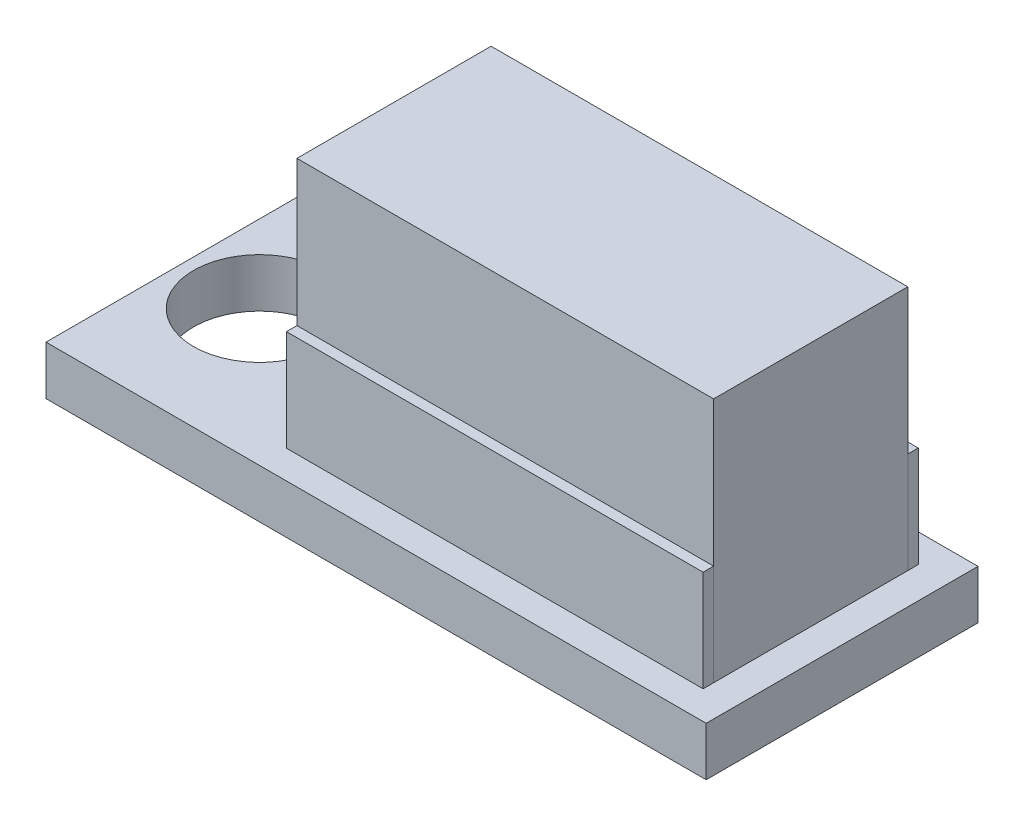
ISO-10303-21;
HEADER;
FILE_DESCRIPTION(('STEP AP214'),'2;1');
FILE_NAME('part.step','',(''),(''),'','','');
FILE_SCHEMA(('AUTOMOTIVE_DESIGN { 1 0 10303 214 1 1 1 1 }'));
ENDSEC;
DATA;
#1=APPLICATION_CONTEXT('core data for automotive mechanical design processes');
#2=APPLICATION_PROTOCOL_DEFINITION('international standard','automotive_design',2000,#1);
#3=PRODUCT_CONTEXT('',#1,'mechanical');
#4=PRODUCT('Part','Part','',(#3));
#5=PRODUCT_RELATED_PRODUCT_CATEGORY('part','',(#4));
#6=PRODUCT_DEFINITION_FORMATION('','',#4);
#7=PRODUCT_DEFINITION_CONTEXT('part definition',#1,'design');
#8=PRODUCT_DEFINITION('design','',#6,#7);
#9=PRODUCT_DEFINITION_SHAPE('','',#8);
#10=(LENGTH_UNIT() NAMED_UNIT(*) SI_UNIT(.MILLI.,.METRE.));
#11=(NAMED_UNIT(*) PLANE_ANGLE_UNIT() SI_UNIT($,.RADIAN.));
#12=(NAMED_UNIT(*) SI_UNIT($,.STERADIAN.) SOLID_ANGLE_UNIT());
#13=UNCERTAINTY_MEASURE_WITH_UNIT(LENGTH_MEASURE(1.E-05),#10,'distance_accuracy_value','');
#14=(GEOMETRIC_REPRESENTATION_CONTEXT(3) GLOBAL_UNCERTAINTY_ASSIGNED_CONTEXT((#13)) GLOBAL_UNIT_ASSIGNED_CONTEXT((#10,
#11,#12)) REPRESENTATION_CONTEXT('',''));
#15=CARTESIAN_POINT('',(0.,0.,0.));
#16=DIRECTION('',(0.,0.,1.));
#17=DIRECTION('',(1.,0.,0.));
#18=AXIS2_PLACEMENT_3D('',#15,#16,#17);
#19=CARTESIAN_POINT('',(-44.7585645073612,9.6393,17.3614974714582));
#20=DIRECTION('',(1.,0.,0.));
#21=DIRECTION('',(0.,0.,-1.));
#22=AXIS2_PLACEMENT_3D('',#19,#20,#21);
#23=PLANE('',#22);
#24=DIRECTION('',(0.,0.,1.));
#25=VECTOR('',#24,1.);
#26=CARTESIAN_POINT('',(-44.7585645073612,0.,17.3614974714582));
#27=LINE('',#26,#25);
#28=CARTESIAN_POINT('',(-44.7585645073612,0.,17.3614974714582));
#29=VERTEX_POINT('',#28);
#30=CARTESIAN_POINT('',(-44.7585645073612,0.,23.7114974714582));
#31=VERTEX_POINT('',#30);
#32=EDGE_CURVE('E106',#29,#31,#27,.T.);
#33=ORIENTED_EDGE('',*,*,#32,.T.);
#34=DIRECTION('',(0.,-1.,0.));
#35=VECTOR('',#34,1.);
#36=CARTESIAN_POINT('',(-44.7585645073612,9.6393,23.7114974714582));
#37=LINE('',#36,#35);
#38=CARTESIAN_POINT('',(-44.7585645073612,9.6393,23.7114974714582));
#39=VERTEX_POINT('',#38);
#40=EDGE_CURVE('E12',#39,#31,#37,.T.);
#41=ORIENTED_EDGE('',*,*,#40,.F.);
#42=DIRECTION('',(0.,0.,1.));
#43=VECTOR('',#42,1.);
#44=CARTESIAN_POINT('',(-44.7585645073612,9.6393,17.3614974714582));
#45=LINE('',#44,#43);
#46=CARTESIAN_POINT('',(-44.7585645073612,9.6393,17.3614974714582));
#47=VERTEX_POINT('',#46);
#48=EDGE_CURVE('E94',#47,#39,#45,.T.);
#49=ORIENTED_EDGE('',*,*,#48,.F.);
#50=DIRECTION('',(0.,-1.,0.));
#51=VECTOR('',#50,1.);
#52=CARTESIAN_POINT('',(-44.7585645073612,9.6393,17.3614974714582));
#53=LINE('',#52,#51);
#54=EDGE_CURVE('E102',#47,#29,#53,.T.);
#55=ORIENTED_EDGE('',*,*,#54,.T.);
#56=EDGE_LOOP('',(#33,#41,#49,#55));
#57=FACE_BOUND('',#56,.T.);
#58=ADVANCED_FACE('F43',(#57),#23,.F.);
#59=CARTESIAN_POINT('',(-44.7585645073612,9.6393,23.7114974714582));
#60=DIRECTION('',(0.,0.,-1.));
#61=DIRECTION('',(-1.,0.,0.));
#62=AXIS2_PLACEMENT_3D('',#59,#60,#61);
#63=PLANE('',#62);
#64=DIRECTION('',(1.,0.,0.));
#65=VECTOR('',#64,1.);
#66=CARTESIAN_POINT('',(-44.7585645073612,0.,23.7114974714582));
#67=LINE('',#66,#65);
#68=CARTESIAN_POINT('',(-31.1314645073612,0.,23.7114974714582));
#69=VERTEX_POINT('',#68);
#70=EDGE_CURVE('E98',#31,#69,#67,.T.);
#71=ORIENTED_EDGE('',*,*,#70,.T.);
#72=DIRECTION('',(0.,-1.,0.));
#73=VECTOR('',#72,1.);
#74=CARTESIAN_POINT('',(-31.1314645073612,9.6393,23.7114974714582));
#75=LINE('',#74,#73);
#76=CARTESIAN_POINT('',(-31.1314645073612,9.6393,23.7114974714582));
#77=VERTEX_POINT('',#76);
#78=EDGE_CURVE('E51',#77,#69,#75,.T.);
#79=ORIENTED_EDGE('',*,*,#78,.F.);
#80=DIRECTION('',(1.,0.,0.));
#81=VECTOR('',#80,1.);
#82=CARTESIAN_POINT('',(-44.7585645073612,9.6393,23.7114974714582));
#83=LINE('',#82,#81);
#84=EDGE_CURVE('E89',#39,#77,#83,.T.);
#85=ORIENTED_EDGE('',*,*,#84,.F.);
#86=ORIENTED_EDGE('',*,*,#40,.T.);
#87=EDGE_LOOP('',(#71,#79,#85,#86));
#88=FACE_BOUND('',#87,.T.);
#89=ADVANCED_FACE('F97',(#88),#63,.F.);
#90=CARTESIAN_POINT('',(-31.1314645073612,9.6393,17.3614974714582));
#91=DIRECTION('',(-1.,0.,0.));
#92=DIRECTION('',(0.,0.,1.));
#93=AXIS2_PLACEMENT_3D('',#90,#91,#92);
#94=PLANE('',#93);
#95=DIRECTION('',(0.,0.,-1.));
#96=VECTOR('',#95,1.);
#97=CARTESIAN_POINT('',(-31.1314645073612,0.,17.3614974714582));
#98=LINE('',#97,#96);
#99=CARTESIAN_POINT('',(-31.1314645073612,0.,17.3614974714582));
#100=VERTEX_POINT('',#99);
#101=EDGE_CURVE('E76',#69,#100,#98,.T.);
#102=ORIENTED_EDGE('',*,*,#101,.T.);
#103=DIRECTION('',(0.,-1.,0.));
#104=VECTOR('',#103,1.);
#105=CARTESIAN_POINT('',(-31.1314645073612,9.6393,17.3614974714582));
#106=LINE('',#105,#104);
#107=CARTESIAN_POINT('',(-31.1314645073612,9.6393,17.3614974714582));
#108=VERTEX_POINT('',#107);
#109=EDGE_CURVE('E99',#108,#100,#106,.T.);
#110=ORIENTED_EDGE('',*,*,#109,.F.);
#111=DIRECTION('',(0.,0.,-1.));
#112=VECTOR('',#111,1.);
#113=CARTESIAN_POINT('',(-31.1314645073612,9.6393,17.3614974714582));
#114=LINE('',#113,#112);
#115=EDGE_CURVE('E92',#77,#108,#114,.T.);
#116=ORIENTED_EDGE('',*,*,#115,.F.);
#117=ORIENTED_EDGE('',*,*,#78,.T.);
#118=EDGE_LOOP('',(#102,#110,#116,#117));
#119=FACE_BOUND('',#118,.T.);
#120=ADVANCED_FACE('F100',(#119),#94,.F.);
#121=CARTESIAN_POINT('',(-44.7585645073612,9.6393,17.3614974714582));
#122=DIRECTION('',(0.,0.,1.));
#123=DIRECTION('',(1.,0.,0.));
#124=AXIS2_PLACEMENT_3D('',#121,#122,#123);
#125=PLANE('',#124);
#126=DIRECTION('',(-1.,0.,0.));
#127=VECTOR('',#126,1.);
#128=CARTESIAN_POINT('',(-44.7585645073612,0.,17.3614974714582));
#129=LINE('',#128,#127);
#130=EDGE_CURVE('E82',#100,#29,#129,.T.);
#131=ORIENTED_EDGE('',*,*,#130,.T.);
#132=ORIENTED_EDGE('',*,*,#54,.F.);
#133=DIRECTION('',(-1.,0.,0.));
#134=VECTOR('',#133,1.);
#135=CARTESIAN_POINT('',(-44.7585645073612,9.6393,17.3614974714582));
#136=LINE('',#135,#134);
#137=EDGE_CURVE('E59',#108,#47,#136,.T.);
#138=ORIENTED_EDGE('',*,*,#137,.F.);
#139=ORIENTED_EDGE('',*,*,#109,.T.);
#140=EDGE_LOOP('',(#131,#132,#138,#139));
#141=FACE_BOUND('',#140,.T.);
#142=ADVANCED_FACE('F113',(#141),#125,.F.);
#143=CARTESIAN_POINT('',(0.,9.6393,0.));
#144=DIRECTION('',(0.,1.,0.));
#145=DIRECTION('',(0.,0.,1.));
#146=AXIS2_PLACEMENT_3D('',#143,#144,#145);
#147=PLANE('',#146);
#148=ORIENTED_EDGE('',*,*,#48,.T.);
#149=ORIENTED_EDGE('',*,*,#84,.T.);
#150=ORIENTED_EDGE('',*,*,#115,.T.);
#151=ORIENTED_EDGE('',*,*,#137,.T.);
#152=EDGE_LOOP('',(#148,#149,#150,#151));
#153=FACE_BOUND('',#152,.T.);
#154=ADVANCED_FACE('F90',(#153),#147,.T.);
#155=CARTESIAN_POINT('',(0.,0.,0.));
#156=DIRECTION('',(0.,1.,0.));
#157=DIRECTION('',(0.,0.,1.));
#158=AXIS2_PLACEMENT_3D('',#155,#156,#157);
#159=PLANE('',#158);
#160=ORIENTED_EDGE('',*,*,#32,.F.);
#161=ORIENTED_EDGE('',*,*,#130,.F.);
#162=ORIENTED_EDGE('',*,*,#101,.F.);
#163=ORIENTED_EDGE('',*,*,#70,.F.);
#164=EDGE_LOOP('',(#160,#161,#162,#163));
#165=FACE_BOUND('',#164,.T.);
#166=ADVANCED_FACE('F116',(#165),#159,.F.);
#167=CLOSED_SHELL('',(#58,#89,#120,#142,#154,#166));
#168=MANIFOLD_SOLID_BREP('B2',#167);
#169=CARTESIAN_POINT('',(0.,1.6002,0.));
#170=DIRECTION('',(0.,1.,0.));
#171=DIRECTION('',(0.,0.,1.));
#172=AXIS2_PLACEMENT_3D('',#169,#170,#171);
#173=PLANE('',#172);
#174=DIRECTION('',(0.,0.,1.));
#175=VECTOR('',#174,1.);
#176=CARTESIAN_POINT('',(-51.6949913910025,1.6002,16.0914974714582));
#177=LINE('',#176,#175);
#178=CARTESIAN_POINT('',(-51.6949913910025,1.6002,16.0914974714582));
#179=VERTEX_POINT('',#178);
#180=CARTESIAN_POINT('',(-51.6949913910025,1.6002,24.9814974714582));
#181=VERTEX_POINT('',#180);
#182=EDGE_CURVE('E285',#179,#181,#177,.T.);
#183=ORIENTED_EDGE('',*,*,#182,.T.);
#184=DIRECTION('',(1.,0.,0.));
#185=VECTOR('',#184,1.);
#186=CARTESIAN_POINT('',(-51.6949913910025,1.6002,24.9814974714582));
#187=LINE('',#186,#185);
#188=CARTESIAN_POINT('',(-30.1049913910025,1.6002,24.9814974714582));
#189=VERTEX_POINT('',#188);
#190=EDGE_CURVE('E219',#181,#189,#187,.T.);
#191=ORIENTED_EDGE('',*,*,#190,.T.);
#192=DIRECTION('',(0.,0.,-1.));
#193=VECTOR('',#192,1.);
#194=CARTESIAN_POINT('',(-30.1049913910025,1.6002,16.0914974714582));
#195=LINE('',#194,#193);
#196=CARTESIAN_POINT('',(-30.1049913910025,1.6002,16.0914974714582));
#197=VERTEX_POINT('',#196);
#198=EDGE_CURVE('E288',#189,#197,#195,.T.);
#199=ORIENTED_EDGE('',*,*,#198,.T.);
#200=DIRECTION('',(-1.,0.,0.));
#201=VECTOR('',#200,1.);
#202=CARTESIAN_POINT('',(-51.6949913910025,1.6002,16.0914974714582));
#203=LINE('',#202,#201);
#204=EDGE_CURVE('E191',#197,#179,#203,.T.);
#205=ORIENTED_EDGE('',*,*,#204,.T.);
#206=EDGE_LOOP('',(#183,#191,#199,#205));
#207=FACE_BOUND('',#206,.T.);
#208=CARTESIAN_POINT('',(-49.1549913910025,1.6002,20.5364974714582));
#209=DIRECTION('',(0.,1.,0.));
#210=DIRECTION('',(0.,0.,1.));
#211=AXIS2_PLACEMENT_3D('',#208,#209,#210);
#212=CIRCLE('',#211,2.159);
#213=CARTESIAN_POINT('',(-49.1549913910025,1.6002,22.6954974714582));
#214=VERTEX_POINT('',#213);
#215=EDGE_CURVE('E279',#214,#214,#212,.T.);
#216=ORIENTED_EDGE('',*,*,#215,.F.);
#217=EDGE_LOOP('',(#216));
#218=FACE_BOUND('',#217,.T.);
#219=DIRECTION('',(1.,0.,0.));
#220=VECTOR('',#219,1.);
#221=CARTESIAN_POINT('',(0.,1.6002,17.0185974714582));
#222=LINE('',#221,#220);
#223=CARTESIAN_POINT('',(-44.7585645073612,1.6002,17.0185974714582));
#224=VERTEX_POINT('',#223);
#225=CARTESIAN_POINT('',(-31.1314645073612,1.6002,17.0185974714582));
#226=VERTEX_POINT('',#225);
#227=EDGE_CURVE('E275',#224,#226,#222,.T.);
#228=ORIENTED_EDGE('',*,*,#227,.T.);
#229=DIRECTION('',(0.,0.,1.));
#230=VECTOR('',#229,1.);
#231=CARTESIAN_POINT('',(-31.1314645073612,1.6002,0.));
#232=LINE('',#231,#230);
#233=CARTESIAN_POINT('',(-31.1314645073612,1.6002,24.0543974714582));
#234=VERTEX_POINT('',#233);
#235=EDGE_CURVE('E264',#226,#234,#232,.T.);
#236=ORIENTED_EDGE('',*,*,#235,.T.);
#237=DIRECTION('',(-1.,0.,0.));
#238=VECTOR('',#237,1.);
#239=CARTESIAN_POINT('',(0.,1.6002,24.0543974714582));
#240=LINE('',#239,#238);
#241=CARTESIAN_POINT('',(-44.7585645073612,1.6002,24.0543974714582));
#242=VERTEX_POINT('',#241);
#243=EDGE_CURVE('E265',#234,#242,#240,.T.);
#244=ORIENTED_EDGE('',*,*,#243,.T.);
#245=DIRECTION('',(0.,0.,-1.));
#246=VECTOR('',#245,1.);
#247=CARTESIAN_POINT('',(-44.7585645073612,1.6002,0.));
#248=LINE('',#247,#246);
#249=EDGE_CURVE('E268',#242,#224,#248,.T.);
#250=ORIENTED_EDGE('',*,*,#249,.T.);
#251=EDGE_LOOP('',(#228,#236,#244,#250));
#252=FACE_BOUND('',#251,.T.);
#253=ADVANCED_FACE('F167',(#207,#218,#252),#173,.T.);
#254=CARTESIAN_POINT('',(0.,0.,0.));
#255=DIRECTION('',(0.,1.,0.));
#256=DIRECTION('',(0.,0.,1.));
#257=AXIS2_PLACEMENT_3D('',#254,#255,#256);
#258=PLANE('',#257);
#259=CARTESIAN_POINT('',(-49.1549913910025,0.,20.5364974714582));
#260=DIRECTION('',(0.,1.,0.));
#261=DIRECTION('',(0.,0.,1.));
#262=AXIS2_PLACEMENT_3D('',#259,#260,#261);
#263=CIRCLE('',#262,2.159);
#264=CARTESIAN_POINT('',(-49.1549913910025,0.,22.6954974714582));
#265=VERTEX_POINT('',#264);
#266=EDGE_CURVE('E278',#265,#265,#263,.T.);
#267=ORIENTED_EDGE('',*,*,#266,.T.);
#268=EDGE_LOOP('',(#267));
#269=FACE_BOUND('',#268,.T.);
#270=DIRECTION('',(0.,0.,1.));
#271=VECTOR('',#270,1.);
#272=CARTESIAN_POINT('',(-51.6949913910025,0.,16.0914974714582));
#273=LINE('',#272,#271);
#274=CARTESIAN_POINT('',(-51.6949913910025,0.,16.0914974714582));
#275=VERTEX_POINT('',#274);
#276=CARTESIAN_POINT('',(-51.6949913910025,0.,24.9814974714582));
#277=VERTEX_POINT('',#276);
#278=EDGE_CURVE('E282',#275,#277,#273,.T.);
#279=ORIENTED_EDGE('',*,*,#278,.F.);
#280=DIRECTION('',(-1.,0.,0.));
#281=VECTOR('',#280,1.);
#282=CARTESIAN_POINT('',(-51.6949913910025,0.,16.0914974714582));
#283=LINE('',#282,#281);
#284=CARTESIAN_POINT('',(-30.1049913910025,0.,16.0914974714582));
#285=VERTEX_POINT('',#284);
#286=EDGE_CURVE('E212',#285,#275,#283,.T.);
#287=ORIENTED_EDGE('',*,*,#286,.F.);
#288=DIRECTION('',(0.,0.,-1.));
#289=VECTOR('',#288,1.);
#290=CARTESIAN_POINT('',(-30.1049913910025,0.,16.0914974714582));
#291=LINE('',#290,#289);
#292=CARTESIAN_POINT('',(-30.1049913910025,0.,24.9814974714582));
#293=VERTEX_POINT('',#292);
#294=EDGE_CURVE('E296',#293,#285,#291,.T.);
#295=ORIENTED_EDGE('',*,*,#294,.F.);
#296=DIRECTION('',(1.,0.,0.));
#297=VECTOR('',#296,1.);
#298=CARTESIAN_POINT('',(-51.6949913910025,0.,24.9814974714582));
#299=LINE('',#298,#297);
#300=EDGE_CURVE('E294',#277,#293,#299,.T.);
#301=ORIENTED_EDGE('',*,*,#300,.F.);
#302=EDGE_LOOP('',(#279,#287,#295,#301));
#303=FACE_BOUND('',#302,.T.);
#304=ADVANCED_FACE('F309',(#269,#303),#258,.F.);
#305=CARTESIAN_POINT('',(-51.6949913910025,1.6002,16.0914974714582));
#306=DIRECTION('',(1.,0.,0.));
#307=DIRECTION('',(0.,0.,-1.));
#308=AXIS2_PLACEMENT_3D('',#305,#306,#307);
#309=PLANE('',#308);
#310=ORIENTED_EDGE('',*,*,#278,.T.);
#311=DIRECTION('',(0.,-1.,0.));
#312=VECTOR('',#311,1.);
#313=CARTESIAN_POINT('',(-51.6949913910025,1.6002,24.9814974714582));
#314=LINE('',#313,#312);
#315=EDGE_CURVE('E41',#181,#277,#314,.T.);
#316=ORIENTED_EDGE('',*,*,#315,.F.);
#317=ORIENTED_EDGE('',*,*,#182,.F.);
#318=DIRECTION('',(0.,-1.,0.));
#319=VECTOR('',#318,1.);
#320=CARTESIAN_POINT('',(-51.6949913910025,1.6002,16.0914974714582));
#321=LINE('',#320,#319);
#322=EDGE_CURVE('E291',#179,#275,#321,.T.);
#323=ORIENTED_EDGE('',*,*,#322,.T.);
#324=EDGE_LOOP('',(#310,#316,#317,#323));
#325=FACE_BOUND('',#324,.T.);
#326=ADVANCED_FACE('F169',(#325),#309,.F.);
#327=CARTESIAN_POINT('',(-51.6949913910025,1.6002,24.9814974714582));
#328=DIRECTION('',(0.,0.,-1.));
#329=DIRECTION('',(-1.,0.,0.));
#330=AXIS2_PLACEMENT_3D('',#327,#328,#329);
#331=PLANE('',#330);
#332=ORIENTED_EDGE('',*,*,#300,.T.);
#333=DIRECTION('',(0.,-1.,0.));
#334=VECTOR('',#333,1.);
#335=CARTESIAN_POINT('',(-30.1049913910025,1.6002,24.9814974714582));
#336=LINE('',#335,#334);
#337=EDGE_CURVE('E175',#189,#293,#336,.T.);
#338=ORIENTED_EDGE('',*,*,#337,.F.);
#339=ORIENTED_EDGE('',*,*,#190,.F.);
#340=ORIENTED_EDGE('',*,*,#315,.T.);
#341=EDGE_LOOP('',(#332,#338,#339,#340));
#342=FACE_BOUND('',#341,.T.);
#343=ADVANCED_FACE('F323',(#342),#331,.F.);
#344=CARTESIAN_POINT('',(-30.1049913910025,1.6002,16.0914974714582));
#345=DIRECTION('',(-1.,0.,0.));
#346=DIRECTION('',(0.,0.,1.));
#347=AXIS2_PLACEMENT_3D('',#344,#345,#346);
#348=PLANE('',#347);
#349=ORIENTED_EDGE('',*,*,#294,.T.);
#350=DIRECTION('',(0.,-1.,0.));
#351=VECTOR('',#350,1.);
#352=CARTESIAN_POINT('',(-30.1049913910025,1.6002,16.0914974714582));
#353=LINE('',#352,#351);
#354=EDGE_CURVE('E300',#197,#285,#353,.T.);
#355=ORIENTED_EDGE('',*,*,#354,.F.);
#356=ORIENTED_EDGE('',*,*,#198,.F.);
#357=ORIENTED_EDGE('',*,*,#337,.T.);
#358=EDGE_LOOP('',(#349,#355,#356,#357));
#359=FACE_BOUND('',#358,.T.);
#360=ADVANCED_FACE('F305',(#359),#348,.F.);
#361=CARTESIAN_POINT('',(-51.6949913910025,1.6002,16.0914974714582));
#362=DIRECTION('',(0.,0.,1.));
#363=DIRECTION('',(1.,0.,0.));
#364=AXIS2_PLACEMENT_3D('',#361,#362,#363);
#365=PLANE('',#364);
#366=ORIENTED_EDGE('',*,*,#286,.T.);
#367=ORIENTED_EDGE('',*,*,#322,.F.);
#368=ORIENTED_EDGE('',*,*,#204,.F.);
#369=ORIENTED_EDGE('',*,*,#354,.T.);
#370=EDGE_LOOP('',(#366,#367,#368,#369));
#371=FACE_BOUND('',#370,.T.);
#372=ADVANCED_FACE('F313',(#371),#365,.F.);
#373=CARTESIAN_POINT('',(-49.1549913910025,1.6002,20.5364974714582));
#374=DIRECTION('',(0.,-1.,0.));
#375=DIRECTION('',(0.,0.,-1.));
#376=AXIS2_PLACEMENT_3D('',#373,#374,#375);
#377=CYLINDRICAL_SURFACE('',#376,2.159);
#378=ORIENTED_EDGE('',*,*,#215,.T.);
#379=EDGE_LOOP('',(#378));
#380=FACE_BOUND('',#379,.T.);
#381=ORIENTED_EDGE('',*,*,#266,.F.);
#382=EDGE_LOOP('',(#381));
#383=FACE_BOUND('',#382,.T.);
#384=ADVANCED_FACE('F315',(#380,#383),#377,.F.);
#385=CARTESIAN_POINT('',(-31.1314645073612,4.9022,17.0185974714582));
#386=DIRECTION('',(-1.,0.,0.));
#387=DIRECTION('',(0.,0.,1.));
#388=AXIS2_PLACEMENT_3D('',#385,#386,#387);
#389=PLANE('',#388);
#390=ORIENTED_EDGE('',*,*,#235,.F.);
#391=DIRECTION('',(0.,-1.,0.));
#392=VECTOR('',#391,1.);
#393=CARTESIAN_POINT('',(-31.1314645073612,4.9022,17.0185974714582));
#394=LINE('',#393,#392);
#395=CARTESIAN_POINT('',(-31.1314645073612,4.9022,17.0185974714582));
#396=VERTEX_POINT('',#395);
#397=EDGE_CURVE('E246',#396,#226,#394,.T.);
#398=ORIENTED_EDGE('',*,*,#397,.F.);
#399=DIRECTION('',(0.,0.,-1.));
#400=VECTOR('',#399,1.);
#401=CARTESIAN_POINT('',(-31.1314645073612,4.9022,17.0185974714582));
#402=LINE('',#401,#400);
#403=CARTESIAN_POINT('',(-31.1314645073612,4.9022,24.0543974714582));
#404=VERTEX_POINT('',#403);
#405=EDGE_CURVE('E253',#404,#396,#402,.T.);
#406=ORIENTED_EDGE('',*,*,#405,.F.);
#407=DIRECTION('',(0.,-1.,0.));
#408=VECTOR('',#407,1.);
#409=CARTESIAN_POINT('',(-31.1314645073612,4.9022,24.0543974714582));
#410=LINE('',#409,#408);
#411=EDGE_CURVE('E416',#404,#234,#410,.T.);
#412=ORIENTED_EDGE('',*,*,#411,.T.);
#413=EDGE_LOOP('',(#390,#398,#406,#412));
#414=FACE_BOUND('',#413,.T.);
#415=ADVANCED_FACE('F262',(#414),#389,.F.);
#416=CARTESIAN_POINT('',(-31.1314645073612,4.9022,17.0185974714582));
#417=DIRECTION('',(0.,0.,1.));
#418=DIRECTION('',(1.,0.,0.));
#419=AXIS2_PLACEMENT_3D('',#416,#417,#418);
#420=PLANE('',#419);
#421=ORIENTED_EDGE('',*,*,#227,.F.);
#422=DIRECTION('',(0.,-1.,0.));
#423=VECTOR('',#422,1.);
#424=CARTESIAN_POINT('',(-44.7585645073612,4.9022,17.0185974714582));
#425=LINE('',#424,#423);
#426=CARTESIAN_POINT('',(-44.7585645073612,4.9022,17.0185974714582));
#427=VERTEX_POINT('',#426);
#428=EDGE_CURVE('E249',#427,#224,#425,.T.);
#429=ORIENTED_EDGE('',*,*,#428,.F.);
#430=DIRECTION('',(-1.,0.,0.));
#431=VECTOR('',#430,1.);
#432=CARTESIAN_POINT('',(-31.1314645073612,4.9022,17.0185974714582));
#433=LINE('',#432,#431);
#434=EDGE_CURVE('E242',#396,#427,#433,.T.);
#435=ORIENTED_EDGE('',*,*,#434,.F.);
#436=ORIENTED_EDGE('',*,*,#397,.T.);
#437=EDGE_LOOP('',(#421,#429,#435,#436));
#438=FACE_BOUND('',#437,.T.);
#439=ADVANCED_FACE('F244',(#438),#420,.F.);
#440=CARTESIAN_POINT('',(-44.7585645073612,4.9022,17.0185974714582));
#441=DIRECTION('',(1.,0.,0.));
#442=DIRECTION('',(0.,0.,-1.));
#443=AXIS2_PLACEMENT_3D('',#440,#441,#442);
#444=PLANE('',#443);
#445=ORIENTED_EDGE('',*,*,#249,.F.);
#446=DIRECTION('',(0.,-1.,0.));
#447=VECTOR('',#446,1.);
#448=CARTESIAN_POINT('',(-44.7585645073612,4.9022,24.0543974714582));
#449=LINE('',#448,#447);
#450=CARTESIAN_POINT('',(-44.7585645073612,4.9022,24.0543974714582));
#451=VERTEX_POINT('',#450);
#452=EDGE_CURVE('E182',#451,#242,#449,.T.);
#453=ORIENTED_EDGE('',*,*,#452,.F.);
#454=DIRECTION('',(0.,0.,1.));
#455=VECTOR('',#454,1.);
#456=CARTESIAN_POINT('',(-44.7585645073612,4.9022,17.0185974714582));
#457=LINE('',#456,#455);
#458=EDGE_CURVE('E252',#427,#451,#457,.T.);
#459=ORIENTED_EDGE('',*,*,#458,.F.);
#460=ORIENTED_EDGE('',*,*,#428,.T.);
#461=EDGE_LOOP('',(#445,#453,#459,#460));
#462=FACE_BOUND('',#461,.T.);
#463=ADVANCED_FACE('F338',(#462),#444,.F.);
#464=CARTESIAN_POINT('',(-31.1314645073612,4.9022,24.0543974714582));
#465=DIRECTION('',(0.,0.,-1.));
#466=DIRECTION('',(-1.,0.,0.));
#467=AXIS2_PLACEMENT_3D('',#464,#465,#466);
#468=PLANE('',#467);
#469=ORIENTED_EDGE('',*,*,#243,.F.);
#470=ORIENTED_EDGE('',*,*,#411,.F.);
#471=DIRECTION('',(1.,0.,0.));
#472=VECTOR('',#471,1.);
#473=CARTESIAN_POINT('',(-31.1314645073612,4.9022,24.0543974714582));
#474=LINE('',#473,#472);
#475=EDGE_CURVE('E257',#451,#404,#474,.T.);
#476=ORIENTED_EDGE('',*,*,#475,.F.);
#477=ORIENTED_EDGE('',*,*,#452,.T.);
#478=EDGE_LOOP('',(#469,#470,#476,#477));
#479=FACE_BOUND('',#478,.T.);
#480=ADVANCED_FACE('F341',(#479),#468,.F.);
#481=CARTESIAN_POINT('',(0.,4.9022,0.));
#482=DIRECTION('',(0.,-1.,0.));
#483=DIRECTION('',(0.,0.,-1.));
#484=AXIS2_PLACEMENT_3D('',#481,#482,#483);
#485=PLANE('',#484);
#486=ORIENTED_EDGE('',*,*,#405,.T.);
#487=ORIENTED_EDGE('',*,*,#434,.T.);
#488=ORIENTED_EDGE('',*,*,#458,.T.);
#489=ORIENTED_EDGE('',*,*,#475,.T.);
#490=EDGE_LOOP('',(#486,#487,#488,#489));
#491=FACE_BOUND('',#490,.T.);
#492=ADVANCED_FACE('F256',(#491),#485,.F.);
#493=CLOSED_SHELL('',(#253,#304,#326,#343,#360,#372,#384,#415,#439,#463,#480,#492));
#494=MANIFOLD_SOLID_BREP('B6',#493);
#495=ADVANCED_BREP_SHAPE_REPRESENTATION('',(#18,#168,#494),#14);
#496=SHAPE_DEFINITION_REPRESENTATION(#9,#495);
ENDSEC;
END-ISO-10303-21;
